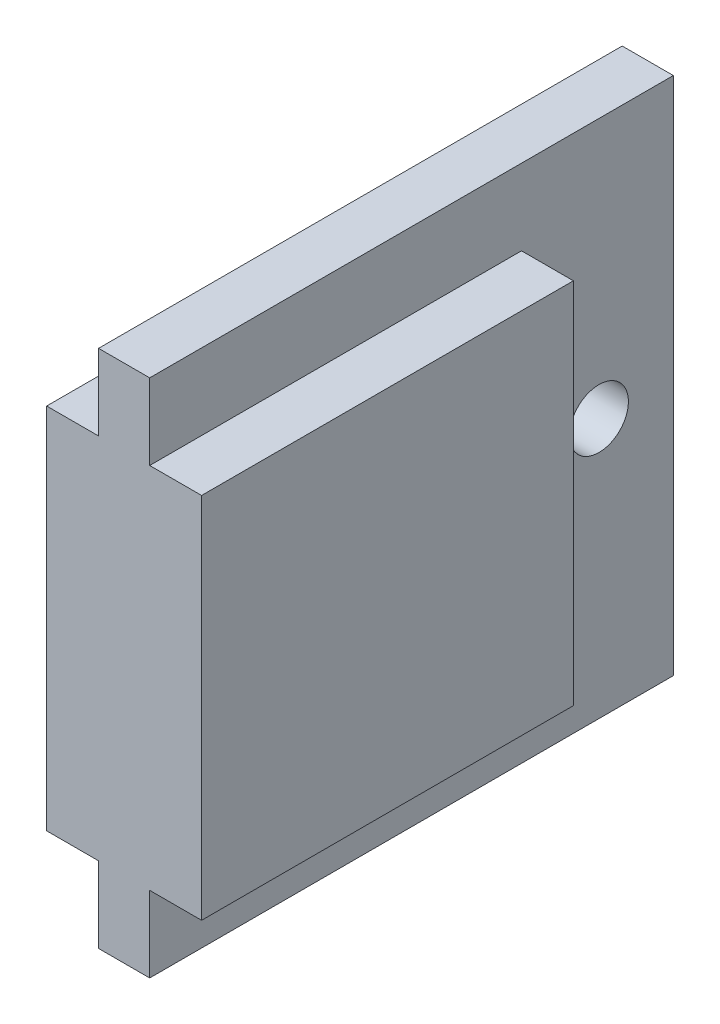
ISO-10303-21;
HEADER;
FILE_DESCRIPTION(('STEP AP214'),'2;1');
FILE_NAME('part.step','',(''),(''),'','','');
FILE_SCHEMA(('AUTOMOTIVE_DESIGN { 1 0 10303 214 1 1 1 1 }'));
ENDSEC;
DATA;
#1=APPLICATION_CONTEXT('core data for automotive mechanical design processes');
#2=APPLICATION_PROTOCOL_DEFINITION('international standard','automotive_design',2000,#1);
#3=PRODUCT_CONTEXT('',#1,'mechanical');
#4=PRODUCT('Part','Part','',(#3));
#5=PRODUCT_RELATED_PRODUCT_CATEGORY('part','',(#4));
#6=PRODUCT_DEFINITION_FORMATION('','',#4);
#7=PRODUCT_DEFINITION_CONTEXT('part definition',#1,'design');
#8=PRODUCT_DEFINITION('design','',#6,#7);
#9=PRODUCT_DEFINITION_SHAPE('','',#8);
#10=(LENGTH_UNIT() NAMED_UNIT(*) SI_UNIT(.MILLI.,.METRE.));
#11=(NAMED_UNIT(*) PLANE_ANGLE_UNIT() SI_UNIT($,.RADIAN.));
#12=(NAMED_UNIT(*) SI_UNIT($,.STERADIAN.) SOLID_ANGLE_UNIT());
#13=UNCERTAINTY_MEASURE_WITH_UNIT(LENGTH_MEASURE(1.E-05),#10,'distance_accuracy_value','');
#14=(GEOMETRIC_REPRESENTATION_CONTEXT(3) GLOBAL_UNCERTAINTY_ASSIGNED_CONTEXT((#13)) GLOBAL_UNIT_ASSIGNED_CONTEXT((#10,
#11,#12)) REPRESENTATION_CONTEXT('',''));
#15=CARTESIAN_POINT('',(0.,0.,0.));
#16=DIRECTION('',(0.,0.,1.));
#17=DIRECTION('',(1.,0.,0.));
#18=AXIS2_PLACEMENT_3D('',#15,#16,#17);
#19=CARTESIAN_POINT('',(-10.,23.75,0.));
#20=DIRECTION('',(0.,1.,0.));
#21=DIRECTION('',(0.,0.,1.));
#22=AXIS2_PLACEMENT_3D('',#19,#20,#21);
#23=PLANE('',#22);
#24=DIRECTION('',(1.,0.,0.));
#25=VECTOR('',#24,1.);
#26=CARTESIAN_POINT('',(-10.,23.75,0.));
#27=LINE('',#26,#25);
#28=CARTESIAN_POINT('',(-3.35,23.75,0.));
#29=VERTEX_POINT('',#28);
#30=CARTESIAN_POINT('',(0.,23.75,0.));
#31=VERTEX_POINT('',#30);
#32=EDGE_CURVE('E266',#29,#31,#27,.T.);
#33=ORIENTED_EDGE('',*,*,#32,.F.);
#34=DIRECTION('',(0.,0.,1.));
#35=VECTOR('',#34,1.);
#36=CARTESIAN_POINT('',(-3.35,23.75,0.));
#37=LINE('',#36,#35);
#38=CARTESIAN_POINT('',(-3.35,23.75,24.));
#39=VERTEX_POINT('',#38);
#40=EDGE_CURVE('E57',#29,#39,#37,.T.);
#41=ORIENTED_EDGE('',*,*,#40,.T.);
#42=DIRECTION('',(1.,0.,0.));
#43=VECTOR('',#42,1.);
#44=CARTESIAN_POINT('',(-10.,23.75,24.));
#45=LINE('',#44,#43);
#46=CARTESIAN_POINT('',(0.,23.75,24.));
#47=VERTEX_POINT('',#46);
#48=EDGE_CURVE('E262',#39,#47,#45,.T.);
#49=ORIENTED_EDGE('',*,*,#48,.T.);
#50=DIRECTION('',(0.,0.,1.));
#51=VECTOR('',#50,1.);
#52=CARTESIAN_POINT('',(0.,23.75,0.));
#53=LINE('',#52,#51);
#54=EDGE_CURVE('E250',#31,#47,#53,.T.);
#55=ORIENTED_EDGE('',*,*,#54,.F.);
#56=EDGE_LOOP('',(#33,#41,#49,#55));
#57=FACE_BOUND('',#56,.T.);
#58=ADVANCED_FACE('F47',(#57),#23,.T.);
#59=CARTESIAN_POINT('',(-10.,0.,0.));
#60=DIRECTION('',(0.,-1.,0.));
#61=DIRECTION('',(0.,0.,-1.));
#62=AXIS2_PLACEMENT_3D('',#59,#60,#61);
#63=PLANE('',#62);
#64=DIRECTION('',(1.,0.,0.));
#65=VECTOR('',#64,1.);
#66=CARTESIAN_POINT('',(-10.,0.,0.));
#67=LINE('',#66,#65);
#68=CARTESIAN_POINT('',(-10.,0.,0.));
#69=VERTEX_POINT('',#68);
#70=CARTESIAN_POINT('',(-6.65,0.,0.));
#71=VERTEX_POINT('',#70);
#72=EDGE_CURVE('E51',#69,#71,#67,.T.);
#73=ORIENTED_EDGE('',*,*,#72,.T.);
#74=DIRECTION('',(0.,0.,1.));
#75=VECTOR('',#74,1.);
#76=CARTESIAN_POINT('',(-6.65,0.,0.));
#77=LINE('',#76,#75);
#78=CARTESIAN_POINT('',(-6.65,0.,24.));
#79=VERTEX_POINT('',#78);
#80=EDGE_CURVE('E73',#71,#79,#77,.T.);
#81=ORIENTED_EDGE('',*,*,#80,.T.);
#82=DIRECTION('',(1.,0.,0.));
#83=VECTOR('',#82,1.);
#84=CARTESIAN_POINT('',(-10.,0.,24.));
#85=LINE('',#84,#83);
#86=CARTESIAN_POINT('',(-10.,0.,24.));
#87=VERTEX_POINT('',#86);
#88=EDGE_CURVE('E203',#87,#79,#85,.T.);
#89=ORIENTED_EDGE('',*,*,#88,.F.);
#90=DIRECTION('',(0.,0.,-1.));
#91=VECTOR('',#90,1.);
#92=CARTESIAN_POINT('',(-10.,0.,0.));
#93=LINE('',#92,#91);
#94=EDGE_CURVE('E225',#87,#69,#93,.T.);
#95=ORIENTED_EDGE('',*,*,#94,.T.);
#96=EDGE_LOOP('',(#73,#81,#89,#95));
#97=FACE_BOUND('',#96,.T.);
#98=ADVANCED_FACE('F290',(#97),#63,.T.);
#99=CARTESIAN_POINT('',(-10.,0.,0.));
#100=DIRECTION('',(0.,0.,-1.));
#101=DIRECTION('',(-1.,0.,0.));
#102=AXIS2_PLACEMENT_3D('',#99,#100,#101);
#103=PLANE('',#102);
#104=CARTESIAN_POINT('',(-10.,23.75,0.));
#105=VERTEX_POINT('',#104);
#106=CARTESIAN_POINT('',(-6.65,23.75,0.));
#107=VERTEX_POINT('',#106);
#108=EDGE_CURVE('E263',#105,#107,#27,.T.);
#109=ORIENTED_EDGE('',*,*,#108,.T.);
#110=DIRECTION('',(0.,-1.,0.));
#111=VECTOR('',#110,1.);
#112=CARTESIAN_POINT('',(-6.65,23.75,0.));
#113=LINE('',#112,#111);
#114=EDGE_CURVE('E212',#107,#71,#113,.T.);
#115=ORIENTED_EDGE('',*,*,#114,.T.);
#116=ORIENTED_EDGE('',*,*,#72,.F.);
#117=DIRECTION('',(0.,1.,0.));
#118=VECTOR('',#117,1.);
#119=CARTESIAN_POINT('',(-10.,0.,0.));
#120=LINE('',#119,#118);
#121=EDGE_CURVE('E229',#69,#105,#120,.T.);
#122=ORIENTED_EDGE('',*,*,#121,.T.);
#123=EDGE_LOOP('',(#109,#115,#116,#122));
#124=FACE_BOUND('',#123,.T.);
#125=ADVANCED_FACE('F298',(#124),#103,.T.);
#126=DIRECTION('',(0.,0.,1.));
#127=VECTOR('',#126,1.);
#128=CARTESIAN_POINT('',(-3.35,0.,0.));
#129=LINE('',#128,#127);
#130=CARTESIAN_POINT('',(-3.35,0.,0.));
#131=VERTEX_POINT('',#130);
#132=CARTESIAN_POINT('',(-3.35,0.,24.));
#133=VERTEX_POINT('',#132);
#134=EDGE_CURVE('E199',#131,#133,#129,.T.);
#135=ORIENTED_EDGE('',*,*,#134,.F.);
#136=CARTESIAN_POINT('',(0.,0.,0.));
#137=VERTEX_POINT('',#136);
#138=EDGE_CURVE('E242',#131,#137,#67,.T.);
#139=ORIENTED_EDGE('',*,*,#138,.T.);
#140=DIRECTION('',(0.,0.,-1.));
#141=VECTOR('',#140,1.);
#142=CARTESIAN_POINT('',(0.,0.,0.));
#143=LINE('',#142,#141);
#144=CARTESIAN_POINT('',(0.,0.,24.));
#145=VERTEX_POINT('',#144);
#146=EDGE_CURVE('E215',#145,#137,#143,.T.);
#147=ORIENTED_EDGE('',*,*,#146,.F.);
#148=EDGE_CURVE('E259',#133,#145,#85,.T.);
#149=ORIENTED_EDGE('',*,*,#148,.F.);
#150=EDGE_LOOP('',(#135,#139,#147,#149));
#151=FACE_BOUND('',#150,.T.);
#152=ADVANCED_FACE('F49',(#151),#63,.T.);
#153=CARTESIAN_POINT('',(-10.,0.,24.));
#154=DIRECTION('',(0.,0.,1.));
#155=DIRECTION('',(1.,0.,0.));
#156=AXIS2_PLACEMENT_3D('',#153,#154,#155);
#157=PLANE('',#156);
#158=DIRECTION('',(0.,-1.,0.));
#159=VECTOR('',#158,1.);
#160=CARTESIAN_POINT('',(0.,0.,24.));
#161=LINE('',#160,#159);
#162=EDGE_CURVE('E230',#47,#145,#161,.T.);
#163=ORIENTED_EDGE('',*,*,#162,.F.);
#164=ORIENTED_EDGE('',*,*,#48,.F.);
#165=DIRECTION('',(0.,-1.,0.));
#166=VECTOR('',#165,1.);
#167=CARTESIAN_POINT('',(-3.35,28.65,24.));
#168=LINE('',#167,#166);
#169=CARTESIAN_POINT('',(-3.35,28.65,24.));
#170=VERTEX_POINT('',#169);
#171=EDGE_CURVE('E65',#170,#39,#168,.T.);
#172=ORIENTED_EDGE('',*,*,#171,.F.);
#173=DIRECTION('',(-1.,0.,0.));
#174=VECTOR('',#173,1.);
#175=CARTESIAN_POINT('',(0.,28.65,24.));
#176=LINE('',#175,#174);
#177=CARTESIAN_POINT('',(-6.65,28.65,24.));
#178=VERTEX_POINT('',#177);
#179=EDGE_CURVE('E145',#170,#178,#176,.T.);
#180=ORIENTED_EDGE('',*,*,#179,.T.);
#181=DIRECTION('',(0.,-1.,0.));
#182=VECTOR('',#181,1.);
#183=CARTESIAN_POINT('',(-6.65,28.65,24.));
#184=LINE('',#183,#182);
#185=CARTESIAN_POINT('',(-6.65,23.75,24.));
#186=VERTEX_POINT('',#185);
#187=EDGE_CURVE('E152',#178,#186,#184,.T.);
#188=ORIENTED_EDGE('',*,*,#187,.T.);
#189=CARTESIAN_POINT('',(-10.,23.75,24.));
#190=VERTEX_POINT('',#189);
#191=EDGE_CURVE('E260',#190,#186,#45,.T.);
#192=ORIENTED_EDGE('',*,*,#191,.F.);
#193=DIRECTION('',(0.,-1.,0.));
#194=VECTOR('',#193,1.);
#195=CARTESIAN_POINT('',(-10.,0.,24.));
#196=LINE('',#195,#194);
#197=EDGE_CURVE('E238',#190,#87,#196,.T.);
#198=ORIENTED_EDGE('',*,*,#197,.T.);
#199=ORIENTED_EDGE('',*,*,#88,.T.);
#200=DIRECTION('',(0.,1.,0.));
#201=VECTOR('',#200,1.);
#202=CARTESIAN_POINT('',(-6.65,-4.9,24.));
#203=LINE('',#202,#201);
#204=CARTESIAN_POINT('',(-6.65,-4.9,24.));
#205=VERTEX_POINT('',#204);
#206=EDGE_CURVE('E196',#205,#79,#203,.T.);
#207=ORIENTED_EDGE('',*,*,#206,.F.);
#208=DIRECTION('',(-1.,0.,0.));
#209=VECTOR('',#208,1.);
#210=CARTESIAN_POINT('',(0.,-4.9,24.));
#211=LINE('',#210,#209);
#212=CARTESIAN_POINT('',(-3.35,-4.9,24.));
#213=VERTEX_POINT('',#212);
#214=EDGE_CURVE('E193',#213,#205,#211,.T.);
#215=ORIENTED_EDGE('',*,*,#214,.F.);
#216=DIRECTION('',(0.,1.,0.));
#217=VECTOR('',#216,1.);
#218=CARTESIAN_POINT('',(-3.35,-4.9,24.));
#219=LINE('',#218,#217);
#220=EDGE_CURVE('E207',#213,#133,#219,.T.);
#221=ORIENTED_EDGE('',*,*,#220,.T.);
#222=ORIENTED_EDGE('',*,*,#148,.T.);
#223=EDGE_LOOP('',(#163,#164,#172,#180,#188,#192,#198,#199,#207,#215,#221,#222));
#224=FACE_BOUND('',#223,.T.);
#225=ADVANCED_FACE('F161',(#224),#157,.T.);
#226=DIRECTION('',(0.,0.,1.));
#227=VECTOR('',#226,1.);
#228=CARTESIAN_POINT('',(-6.65,23.75,0.));
#229=LINE('',#228,#227);
#230=EDGE_CURVE('E11',#107,#186,#229,.T.);
#231=ORIENTED_EDGE('',*,*,#230,.F.);
#232=ORIENTED_EDGE('',*,*,#108,.F.);
#233=DIRECTION('',(0.,0.,1.));
#234=VECTOR('',#233,1.);
#235=CARTESIAN_POINT('',(-10.,23.75,0.));
#236=LINE('',#235,#234);
#237=EDGE_CURVE('E234',#105,#190,#236,.T.);
#238=ORIENTED_EDGE('',*,*,#237,.T.);
#239=ORIENTED_EDGE('',*,*,#191,.T.);
#240=EDGE_LOOP('',(#231,#232,#238,#239));
#241=FACE_BOUND('',#240,.T.);
#242=ADVANCED_FACE('F292',(#241),#23,.T.);
#243=DIRECTION('',(0.,-1.,0.));
#244=VECTOR('',#243,1.);
#245=CARTESIAN_POINT('',(-3.35,23.75,0.));
#246=LINE('',#245,#244);
#247=EDGE_CURVE('E216',#29,#131,#246,.T.);
#248=ORIENTED_EDGE('',*,*,#247,.F.);
#249=ORIENTED_EDGE('',*,*,#32,.T.);
#250=DIRECTION('',(0.,1.,0.));
#251=VECTOR('',#250,1.);
#252=CARTESIAN_POINT('',(0.,0.,0.));
#253=LINE('',#252,#251);
#254=EDGE_CURVE('E246',#137,#31,#253,.T.);
#255=ORIENTED_EDGE('',*,*,#254,.F.);
#256=ORIENTED_EDGE('',*,*,#138,.F.);
#257=EDGE_LOOP('',(#248,#249,#255,#256));
#258=FACE_BOUND('',#257,.T.);
#259=ADVANCED_FACE('F280',(#258),#103,.T.);
#260=CARTESIAN_POINT('',(-10.,0.,0.));
#261=DIRECTION('',(-1.,0.,0.));
#262=DIRECTION('',(0.,0.,1.));
#263=AXIS2_PLACEMENT_3D('',#260,#261,#262);
#264=PLANE('',#263);
#265=ORIENTED_EDGE('',*,*,#94,.F.);
#266=ORIENTED_EDGE('',*,*,#197,.F.);
#267=ORIENTED_EDGE('',*,*,#237,.F.);
#268=ORIENTED_EDGE('',*,*,#121,.F.);
#269=EDGE_LOOP('',(#265,#266,#267,#268));
#270=FACE_BOUND('',#269,.T.);
#271=ADVANCED_FACE('F306',(#270),#264,.T.);
#272=CARTESIAN_POINT('',(0.,0.,0.));
#273=DIRECTION('',(-1.,0.,0.));
#274=DIRECTION('',(0.,0.,1.));
#275=AXIS2_PLACEMENT_3D('',#272,#273,#274);
#276=PLANE('',#275);
#277=ORIENTED_EDGE('',*,*,#146,.T.);
#278=ORIENTED_EDGE('',*,*,#254,.T.);
#279=ORIENTED_EDGE('',*,*,#54,.T.);
#280=ORIENTED_EDGE('',*,*,#162,.T.);
#281=EDGE_LOOP('',(#277,#278,#279,#280));
#282=FACE_BOUND('',#281,.T.);
#283=ADVANCED_FACE('F282',(#282),#276,.F.);
#284=CARTESIAN_POINT('',(-6.65,23.75,0.));
#285=DIRECTION('',(-1.,0.,0.));
#286=DIRECTION('',(0.,0.,1.));
#287=AXIS2_PLACEMENT_3D('',#284,#285,#286);
#288=PLANE('',#287);
#289=CARTESIAN_POINT('',(-6.65,11.875,-5.));
#290=DIRECTION('',(-1.,0.,0.));
#291=DIRECTION('',(0.,0.,1.));
#292=AXIS2_PLACEMENT_3D('',#289,#290,#291);
#293=CIRCLE('',#292,1.9);
#294=CARTESIAN_POINT('',(-6.65,11.875,-3.1));
#295=VERTEX_POINT('',#294);
#296=EDGE_CURVE('E158',#295,#295,#293,.T.);
#297=ORIENTED_EDGE('',*,*,#296,.F.);
#298=EDGE_LOOP('',(#297));
#299=FACE_BOUND('',#298,.T.);
#300=DIRECTION('',(0.,-1.,0.));
#301=VECTOR('',#300,1.);
#302=CARTESIAN_POINT('',(-6.65,23.75,-9.8));
#303=LINE('',#302,#301);
#304=CARTESIAN_POINT('',(-6.65,28.65,-9.8));
#305=VERTEX_POINT('',#304);
#306=CARTESIAN_POINT('',(-6.65,-4.9,-9.8));
#307=VERTEX_POINT('',#306);
#308=EDGE_CURVE('E211',#305,#307,#303,.T.);
#309=ORIENTED_EDGE('',*,*,#308,.T.);
#310=DIRECTION('',(0.,0.,1.));
#311=VECTOR('',#310,1.);
#312=CARTESIAN_POINT('',(-6.65,-4.9,0.));
#313=LINE('',#312,#311);
#314=EDGE_CURVE('E182',#307,#205,#313,.T.);
#315=ORIENTED_EDGE('',*,*,#314,.T.);
#316=ORIENTED_EDGE('',*,*,#206,.T.);
#317=ORIENTED_EDGE('',*,*,#80,.F.);
#318=ORIENTED_EDGE('',*,*,#114,.F.);
#319=ORIENTED_EDGE('',*,*,#230,.T.);
#320=ORIENTED_EDGE('',*,*,#187,.F.);
#321=DIRECTION('',(0.,0.,1.));
#322=VECTOR('',#321,1.);
#323=CARTESIAN_POINT('',(-6.65,28.65,0.));
#324=LINE('',#323,#322);
#325=EDGE_CURVE('E140',#305,#178,#324,.T.);
#326=ORIENTED_EDGE('',*,*,#325,.F.);
#327=EDGE_LOOP('',(#309,#315,#316,#317,#318,#319,#320,#326));
#328=FACE_BOUND('',#327,.T.);
#329=ADVANCED_FACE('F153',(#299,#328),#288,.T.);
#330=CARTESIAN_POINT('',(-3.35,23.75,0.));
#331=DIRECTION('',(-1.,0.,0.));
#332=DIRECTION('',(0.,0.,1.));
#333=AXIS2_PLACEMENT_3D('',#330,#331,#332);
#334=PLANE('',#333);
#335=CARTESIAN_POINT('',(-3.35,11.875,-5.));
#336=DIRECTION('',(-1.,0.,0.));
#337=DIRECTION('',(0.,0.,1.));
#338=AXIS2_PLACEMENT_3D('',#335,#336,#337);
#339=CIRCLE('',#338,1.9);
#340=CARTESIAN_POINT('',(-3.35,11.875,-3.1));
#341=VERTEX_POINT('',#340);
#342=EDGE_CURVE('E178',#341,#341,#339,.F.);
#343=ORIENTED_EDGE('',*,*,#342,.F.);
#344=EDGE_LOOP('',(#343));
#345=FACE_BOUND('',#344,.T.);
#346=ORIENTED_EDGE('',*,*,#247,.T.);
#347=ORIENTED_EDGE('',*,*,#134,.T.);
#348=ORIENTED_EDGE('',*,*,#220,.F.);
#349=DIRECTION('',(0.,0.,1.));
#350=VECTOR('',#349,1.);
#351=CARTESIAN_POINT('',(-3.35,-4.9,0.));
#352=LINE('',#351,#350);
#353=CARTESIAN_POINT('',(-3.35,-4.9,-9.8));
#354=VERTEX_POINT('',#353);
#355=EDGE_CURVE('E190',#354,#213,#352,.T.);
#356=ORIENTED_EDGE('',*,*,#355,.F.);
#357=DIRECTION('',(0.,-1.,0.));
#358=VECTOR('',#357,1.);
#359=CARTESIAN_POINT('',(-3.35,23.75,-9.8));
#360=LINE('',#359,#358);
#361=CARTESIAN_POINT('',(-3.35,28.65,-9.8));
#362=VERTEX_POINT('',#361);
#363=EDGE_CURVE('E220',#362,#354,#360,.T.);
#364=ORIENTED_EDGE('',*,*,#363,.F.);
#365=DIRECTION('',(0.,0.,1.));
#366=VECTOR('',#365,1.);
#367=CARTESIAN_POINT('',(-3.35,28.65,0.));
#368=LINE('',#367,#366);
#369=EDGE_CURVE('E164',#362,#170,#368,.T.);
#370=ORIENTED_EDGE('',*,*,#369,.T.);
#371=ORIENTED_EDGE('',*,*,#171,.T.);
#372=ORIENTED_EDGE('',*,*,#40,.F.);
#373=EDGE_LOOP('',(#346,#347,#348,#356,#364,#370,#371,#372));
#374=FACE_BOUND('',#373,.T.);
#375=ADVANCED_FACE('F286',(#345,#374),#334,.F.);
#376=CARTESIAN_POINT('',(0.,23.75,-9.8));
#377=DIRECTION('',(0.,0.,-1.));
#378=DIRECTION('',(0.,1.,0.));
#379=AXIS2_PLACEMENT_3D('',#376,#377,#378);
#380=PLANE('',#379);
#381=ORIENTED_EDGE('',*,*,#363,.T.);
#382=DIRECTION('',(1.,0.,0.));
#383=VECTOR('',#382,1.);
#384=CARTESIAN_POINT('',(0.,-4.9,-9.8));
#385=LINE('',#384,#383);
#386=EDGE_CURVE('E186',#307,#354,#385,.T.);
#387=ORIENTED_EDGE('',*,*,#386,.F.);
#388=ORIENTED_EDGE('',*,*,#308,.F.);
#389=DIRECTION('',(1.,0.,0.));
#390=VECTOR('',#389,1.);
#391=CARTESIAN_POINT('',(0.,28.65,-9.8));
#392=LINE('',#391,#390);
#393=EDGE_CURVE('E147',#305,#362,#392,.T.);
#394=ORIENTED_EDGE('',*,*,#393,.T.);
#395=EDGE_LOOP('',(#381,#387,#388,#394));
#396=FACE_BOUND('',#395,.T.);
#397=ADVANCED_FACE('F318',(#396),#380,.T.);
#398=CARTESIAN_POINT('',(0.,-4.9,0.));
#399=DIRECTION('',(0.,-1.,0.));
#400=DIRECTION('',(0.,0.,-1.));
#401=AXIS2_PLACEMENT_3D('',#398,#399,#400);
#402=PLANE('',#401);
#403=ORIENTED_EDGE('',*,*,#314,.F.);
#404=ORIENTED_EDGE('',*,*,#386,.T.);
#405=ORIENTED_EDGE('',*,*,#355,.T.);
#406=ORIENTED_EDGE('',*,*,#214,.T.);
#407=EDGE_LOOP('',(#403,#404,#405,#406));
#408=FACE_BOUND('',#407,.T.);
#409=ADVANCED_FACE('F316',(#408),#402,.T.);
#410=CARTESIAN_POINT('',(0.00100000000000013,11.875,-5.));
#411=DIRECTION('',(-1.,0.,0.));
#412=DIRECTION('',(0.,0.,1.));
#413=AXIS2_PLACEMENT_3D('',#410,#411,#412);
#414=CYLINDRICAL_SURFACE('',#413,1.9);
#415=CARTESIAN_POINT('',(-6.65,11.875,-3.1));
#416=CARTESIAN_POINT('',(-6.615625,11.875,-3.1));
#417=CARTESIAN_POINT('',(-6.58125,11.875,-3.1));
#418=CARTESIAN_POINT('',(-6.5125,11.875,-3.1));
#419=CARTESIAN_POINT('',(-6.478125,11.875,-3.1));
#420=CARTESIAN_POINT('',(-6.409375,11.875,-3.1));
#421=CARTESIAN_POINT('',(-6.375,11.875,-3.1));
#422=CARTESIAN_POINT('',(-6.30625,11.875,-3.1));
#423=CARTESIAN_POINT('',(-6.271875,11.875,-3.1));
#424=CARTESIAN_POINT('',(-6.203125,11.875,-3.1));
#425=CARTESIAN_POINT('',(-6.16875,11.875,-3.1));
#426=CARTESIAN_POINT('',(-6.1,11.875,-3.1));
#427=CARTESIAN_POINT('',(-6.065625,11.875,-3.1));
#428=CARTESIAN_POINT('',(-5.996875,11.875,-3.1));
#429=CARTESIAN_POINT('',(-5.9625,11.875,-3.1));
#430=CARTESIAN_POINT('',(-5.89375,11.875,-3.1));
#431=CARTESIAN_POINT('',(-5.859375,11.875,-3.1));
#432=CARTESIAN_POINT('',(-5.790625,11.875,-3.1));
#433=CARTESIAN_POINT('',(-5.75625,11.875,-3.1));
#434=CARTESIAN_POINT('',(-5.6875,11.875,-3.1));
#435=CARTESIAN_POINT('',(-5.653125,11.875,-3.1));
#436=CARTESIAN_POINT('',(-5.584375,11.875,-3.1));
#437=CARTESIAN_POINT('',(-5.55,11.875,-3.1));
#438=CARTESIAN_POINT('',(-5.48125,11.875,-3.1));
#439=CARTESIAN_POINT('',(-5.446875,11.875,-3.1));
#440=CARTESIAN_POINT('',(-5.378125,11.875,-3.1));
#441=CARTESIAN_POINT('',(-5.34375,11.875,-3.1));
#442=CARTESIAN_POINT('',(-5.275,11.875,-3.1));
#443=CARTESIAN_POINT('',(-5.240625,11.875,-3.1));
#444=CARTESIAN_POINT('',(-5.171875,11.875,-3.1));
#445=CARTESIAN_POINT('',(-5.1375,11.875,-3.1));
#446=CARTESIAN_POINT('',(-5.06875,11.875,-3.1));
#447=CARTESIAN_POINT('',(-5.034375,11.875,-3.1));
#448=CARTESIAN_POINT('',(-4.965625,11.875,-3.1));
#449=CARTESIAN_POINT('',(-4.93125,11.875,-3.1));
#450=CARTESIAN_POINT('',(-4.8625,11.875,-3.1));
#451=CARTESIAN_POINT('',(-4.828125,11.875,-3.1));
#452=CARTESIAN_POINT('',(-4.759375,11.875,-3.1));
#453=CARTESIAN_POINT('',(-4.725,11.875,-3.1));
#454=CARTESIAN_POINT('',(-4.65625,11.875,-3.1));
#455=CARTESIAN_POINT('',(-4.621875,11.875,-3.1));
#456=CARTESIAN_POINT('',(-4.553125,11.875,-3.1));
#457=CARTESIAN_POINT('',(-4.51875,11.875,-3.1));
#458=CARTESIAN_POINT('',(-4.45,11.875,-3.1));
#459=CARTESIAN_POINT('',(-4.415625,11.875,-3.1));
#460=CARTESIAN_POINT('',(-4.346875,11.875,-3.1));
#461=CARTESIAN_POINT('',(-4.3125,11.875,-3.1));
#462=CARTESIAN_POINT('',(-4.24375,11.875,-3.1));
#463=CARTESIAN_POINT('',(-4.209375,11.875,-3.1));
#464=CARTESIAN_POINT('',(-4.140625,11.875,-3.1));
#465=CARTESIAN_POINT('',(-4.10625,11.875,-3.1));
#466=CARTESIAN_POINT('',(-4.0375,11.875,-3.1));
#467=CARTESIAN_POINT('',(-4.003125,11.875,-3.1));
#468=CARTESIAN_POINT('',(-3.934375,11.875,-3.1));
#469=CARTESIAN_POINT('',(-3.9,11.875,-3.1));
#470=CARTESIAN_POINT('',(-3.83125,11.875,-3.1));
#471=CARTESIAN_POINT('',(-3.796875,11.875,-3.1));
#472=CARTESIAN_POINT('',(-3.728125,11.875,-3.1));
#473=CARTESIAN_POINT('',(-3.69375,11.875,-3.1));
#474=CARTESIAN_POINT('',(-3.625,11.875,-3.1));
#475=CARTESIAN_POINT('',(-3.590625,11.875,-3.1));
#476=CARTESIAN_POINT('',(-3.521875,11.875,-3.1));
#477=CARTESIAN_POINT('',(-3.4875,11.875,-3.1));
#478=CARTESIAN_POINT('',(-3.41875,11.875,-3.1));
#479=CARTESIAN_POINT('',(-3.384375,11.875,-3.1));
#480=CARTESIAN_POINT('',(-3.35,11.875,-3.1));
#481=B_SPLINE_CURVE_WITH_KNOTS('',3,(#415,#416,#417,#418,#419,#420,#421,#422,#423,#424,#425,
#426,#427,#428,#429,#430,#431,#432,#433,#434,#435,#436,#437,#438,#439,#440,#441,#442,#443,#444,
#445,#446,#447,#448,#449,#450,#451,#452,#453,#454,#455,#456,#457,#458,#459,#460,#461,#462,#463,
#464,#465,#466,#467,#468,#469,#470,#471,#472,#473,#474,#475,#476,#477,#478,#479,#480),
.UNSPECIFIED.,.F.,.F.,(4,2,2,2,2,2,2,2,2,2,2,2,2,2,2,2,2,2,2,2,2,2,2,2,2,2,2,2,2,2,2,2,4),(0.,
0.103125,0.20625,0.309375,0.4125,0.515625,0.618749999999999,0.721875,0.824999999999999,0.928125,
1.03125,1.134375,1.2375,1.340625,1.44375,1.546875,1.65,1.753125,1.85625,1.959375,2.0625,
2.165625,2.26875,2.371875,2.475,2.578125,2.68125,2.784375,2.8875,2.990625,3.09375,3.196875,3.3),.UNSPECIFIED.);
#482=EDGE_CURVE('BSEAM326',#295,#341,#481,.T.);
#483=ORIENTED_EDGE('',*,*,#296,.T.);
#484=ORIENTED_EDGE('',*,*,#342,.T.);
#485=ORIENTED_EDGE('',*,*,#482,.T.);
#486=ORIENTED_EDGE('',*,*,#482,.F.);
#487=EDGE_LOOP('',(#483,#485,#484,#486));
#488=FACE_BOUND('',#487,.T.);
#489=ADVANCED_FACE('F326',(#488),#414,.F.);
#490=CARTESIAN_POINT('',(0.,28.65,0.));
#491=DIRECTION('',(0.,1.,0.));
#492=DIRECTION('',(0.,0.,-1.));
#493=AXIS2_PLACEMENT_3D('',#490,#491,#492);
#494=PLANE('',#493);
#495=ORIENTED_EDGE('',*,*,#325,.T.);
#496=ORIENTED_EDGE('',*,*,#179,.F.);
#497=ORIENTED_EDGE('',*,*,#369,.F.);
#498=ORIENTED_EDGE('',*,*,#393,.F.);
#499=EDGE_LOOP('',(#495,#496,#497,#498));
#500=FACE_BOUND('',#499,.T.);
#501=ADVANCED_FACE('F142',(#500),#494,.T.);
#502=CLOSED_SHELL('',(#58,#98,#125,#152,#225,#242,#259,#271,#283,#329,#375,#397,#409,#489,#501));
#503=MANIFOLD_SOLID_BREP('B2',#502);
#504=ADVANCED_BREP_SHAPE_REPRESENTATION('',(#18,#503),#14);
#505=SHAPE_DEFINITION_REPRESENTATION(#9,#504);
ENDSEC;
END-ISO-10303-21;
